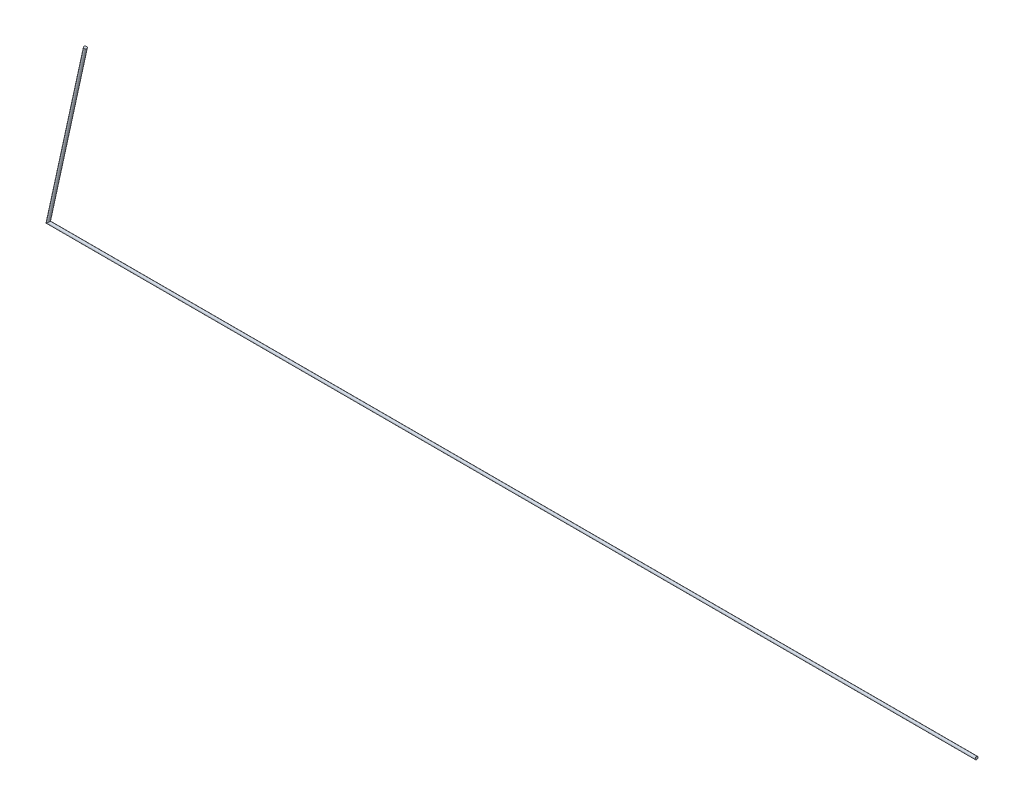
ISO-10303-21;
HEADER;
FILE_DESCRIPTION(('STEP AP214'),'2;1');
FILE_NAME('part.step','',(''),(''),'','','');
FILE_SCHEMA(('AUTOMOTIVE_DESIGN { 1 0 10303 214 1 1 1 1 }'));
ENDSEC;
DATA;
#1=APPLICATION_CONTEXT('core data for automotive mechanical design processes');
#2=APPLICATION_PROTOCOL_DEFINITION('international standard','automotive_design',2000,#1);
#3=PRODUCT_CONTEXT('',#1,'mechanical');
#4=PRODUCT('Part','Part','',(#3));
#5=PRODUCT_RELATED_PRODUCT_CATEGORY('part','',(#4));
#6=PRODUCT_DEFINITION_FORMATION('','',#4);
#7=PRODUCT_DEFINITION_CONTEXT('part definition',#1,'design');
#8=PRODUCT_DEFINITION('design','',#6,#7);
#9=PRODUCT_DEFINITION_SHAPE('','',#8);
#10=(LENGTH_UNIT() NAMED_UNIT(*) SI_UNIT(.MILLI.,.METRE.));
#11=(NAMED_UNIT(*) PLANE_ANGLE_UNIT() SI_UNIT($,.RADIAN.));
#12=(NAMED_UNIT(*) SI_UNIT($,.STERADIAN.) SOLID_ANGLE_UNIT());
#13=UNCERTAINTY_MEASURE_WITH_UNIT(LENGTH_MEASURE(1.E-05),#10,'distance_accuracy_value','');
#14=(GEOMETRIC_REPRESENTATION_CONTEXT(3) GLOBAL_UNCERTAINTY_ASSIGNED_CONTEXT((#13)) GLOBAL_UNIT_ASSIGNED_CONTEXT((#10,
#11,#12)) REPRESENTATION_CONTEXT('',''));
#15=CARTESIAN_POINT('',(0.,0.,0.));
#16=DIRECTION('',(0.,0.,1.));
#17=DIRECTION('',(1.,0.,0.));
#18=AXIS2_PLACEMENT_3D('',#15,#16,#17);
#19=CARTESIAN_POINT('',(-120.,22.86,0.));
#20=DIRECTION('',(-0.213671389508221,-0.976905592831583,0.));
#21=DIRECTION('',(0.,0.,-1.));
#22=AXIS2_PLACEMENT_3D('',#19,#20,#21);
#23=PLANE('',#22);
#24=CARTESIAN_POINT('',(-120.,22.86,0.));
#25=DIRECTION('',(-0.213671389508221,-0.976905592831583,0.));
#26=DIRECTION('',(0.,0.,-1.));
#27=AXIS2_PLACEMENT_3D('',#24,#25,#26);
#28=CIRCLE('',#27,0.1905);
#29=CARTESIAN_POINT('',(-120.,22.86,-0.1905));
#30=VERTEX_POINT('',#29);
#31=EDGE_CURVE('E34',#30,#30,#28,.T.);
#32=ORIENTED_EDGE('',*,*,#31,.F.);
#33=EDGE_LOOP('',(#32));
#34=FACE_BOUND('',#33,.T.);
#35=ADVANCED_FACE('F31',(#34),#23,.F.);
#36=CARTESIAN_POINT('',(0.,0.,0.));
#37=DIRECTION('',(1.,0.,0.));
#38=DIRECTION('',(0.,0.,-1.));
#39=AXIS2_PLACEMENT_3D('',#36,#37,#38);
#40=PLANE('',#39);
#41=CARTESIAN_POINT('',(0.,0.,0.));
#42=DIRECTION('',(1.,0.,0.));
#43=DIRECTION('',(0.,0.,-1.));
#44=AXIS2_PLACEMENT_3D('',#41,#42,#43);
#45=CIRCLE('',#44,0.1905);
#46=CARTESIAN_POINT('',(0.,0.,-0.1905));
#47=VERTEX_POINT('',#46);
#48=EDGE_CURVE('E38',#47,#47,#45,.T.);
#49=ORIENTED_EDGE('',*,*,#48,.T.);
#50=EDGE_LOOP('',(#49));
#51=FACE_BOUND('',#50,.T.);
#52=ADVANCED_FACE('F51',(#51),#40,.T.);
#53=CARTESIAN_POINT('',(-125.132620349656,-0.606340238626044,0.));
#54=DIRECTION('',(0.213671389508221,0.976905592831583,0.));
#55=DIRECTION('',(-0.976905592831583,0.213671389508221,0.));
#56=AXIS2_PLACEMENT_3D('',#53,#54,#55);
#57=CYLINDRICAL_SURFACE('',#56,0.1905);
#58=CARTESIAN_POINT('',(-125.,0.,0.));
#59=DIRECTION('',(-0.627028153471509,0.778996594828315,0.));
#60=DIRECTION('',(-0.778996594828315,-0.627028153471509,0.));
#61=AXIS2_PLACEMENT_3D('',#58,#59,#60);
#62=ELLIPSE('',#61,0.303814109375005,0.1905);
#63=CARTESIAN_POINT('',(-125.236670156664,-0.1905,0.));
#64=VERTEX_POINT('',#63);
#65=EDGE_CURVE('E10',#64,#64,#62,.T.);
#66=ORIENTED_EDGE('',*,*,#65,.T.);
#67=EDGE_LOOP('',(#66));
#68=FACE_BOUND('',#67,.T.);
#69=ORIENTED_EDGE('',*,*,#31,.T.);
#70=EDGE_LOOP('',(#69));
#71=FACE_BOUND('',#70,.T.);
#72=ADVANCED_FACE('F48',(#68,#71),#57,.T.);
#73=CARTESIAN_POINT('',(0.,0.,0.));
#74=DIRECTION('',(-1.,0.,0.));
#75=DIRECTION('',(0.,0.,1.));
#76=AXIS2_PLACEMENT_3D('',#73,#74,#75);
#77=CYLINDRICAL_SURFACE('',#76,0.1905);
#78=ORIENTED_EDGE('',*,*,#48,.F.);
#79=EDGE_LOOP('',(#78));
#80=FACE_BOUND('',#79,.T.);
#81=ORIENTED_EDGE('',*,*,#65,.F.);
#82=EDGE_LOOP('',(#81));
#83=FACE_BOUND('',#82,.T.);
#84=ADVANCED_FACE('F55',(#80,#83),#77,.T.);
#85=CLOSED_SHELL('',(#35,#52,#72,#84));
#86=MANIFOLD_SOLID_BREP('B2',#85);
#87=ADVANCED_BREP_SHAPE_REPRESENTATION('',(#18,#86),#14);
#88=SHAPE_DEFINITION_REPRESENTATION(#9,#87);
ENDSEC;
END-ISO-10303-21;
